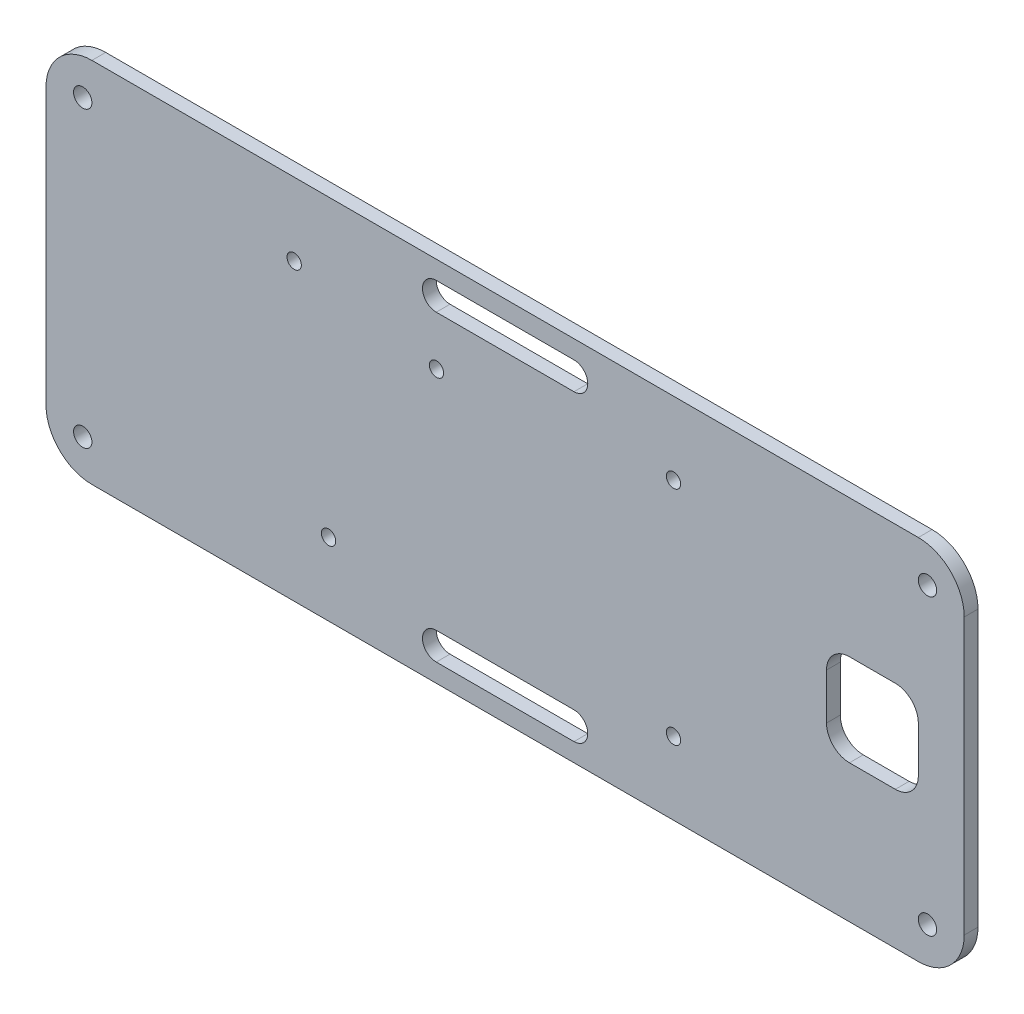
ISO-10303-21;
HEADER;
FILE_DESCRIPTION(('STEP AP214'),'2;1');
FILE_NAME('part.step','',(''),(''),'','','');
FILE_SCHEMA(('AUTOMOTIVE_DESIGN { 1 0 10303 214 1 1 1 1 }'));
ENDSEC;
DATA;
#1=APPLICATION_CONTEXT('core data for automotive mechanical design processes');
#2=APPLICATION_PROTOCOL_DEFINITION('international standard','automotive_design',2000,#1);
#3=PRODUCT_CONTEXT('',#1,'mechanical');
#4=PRODUCT('Part','Part','',(#3));
#5=PRODUCT_RELATED_PRODUCT_CATEGORY('part','',(#4));
#6=PRODUCT_DEFINITION_FORMATION('','',#4);
#7=PRODUCT_DEFINITION_CONTEXT('part definition',#1,'design');
#8=PRODUCT_DEFINITION('design','',#6,#7);
#9=PRODUCT_DEFINITION_SHAPE('','',#8);
#10=(LENGTH_UNIT() NAMED_UNIT(*) SI_UNIT(.MILLI.,.METRE.));
#11=(NAMED_UNIT(*) PLANE_ANGLE_UNIT() SI_UNIT($,.RADIAN.));
#12=(NAMED_UNIT(*) SI_UNIT($,.STERADIAN.) SOLID_ANGLE_UNIT());
#13=UNCERTAINTY_MEASURE_WITH_UNIT(LENGTH_MEASURE(1.E-05),#10,'distance_accuracy_value','');
#14=(GEOMETRIC_REPRESENTATION_CONTEXT(3) GLOBAL_UNCERTAINTY_ASSIGNED_CONTEXT((#13)) GLOBAL_UNIT_ASSIGNED_CONTEXT((#10,
#11,#12)) REPRESENTATION_CONTEXT('',''));
#15=CARTESIAN_POINT('',(0.,0.,0.));
#16=DIRECTION('',(0.,0.,1.));
#17=DIRECTION('',(1.,0.,0.));
#18=AXIS2_PLACEMENT_3D('',#15,#16,#17);
#19=CARTESIAN_POINT('',(100.,40.,3.));
#20=DIRECTION('',(-1.,0.,0.));
#21=DIRECTION('',(0.,0.,1.));
#22=AXIS2_PLACEMENT_3D('',#19,#20,#21);
#23=PLANE('',#22);
#24=DIRECTION('',(0.,1.,0.));
#25=VECTOR('',#24,1.);
#26=CARTESIAN_POINT('',(100.,40.,3.));
#27=LINE('',#26,#25);
#28=CARTESIAN_POINT('',(100.,-30.,3.));
#29=VERTEX_POINT('',#28);
#30=CARTESIAN_POINT('',(100.,30.,3.));
#31=VERTEX_POINT('',#30);
#32=EDGE_CURVE('E341',#29,#31,#27,.T.);
#33=ORIENTED_EDGE('',*,*,#32,.F.);
#34=DIRECTION('',(0.,0.,-1.));
#35=VECTOR('',#34,1.);
#36=CARTESIAN_POINT('',(100.,-30.,3.));
#37=LINE('',#36,#35);
#38=CARTESIAN_POINT('',(100.,-30.,0.));
#39=VERTEX_POINT('',#38);
#40=EDGE_CURVE('E392',#29,#39,#37,.T.);
#41=ORIENTED_EDGE('',*,*,#40,.T.);
#42=DIRECTION('',(0.,1.,0.));
#43=VECTOR('',#42,1.);
#44=CARTESIAN_POINT('',(100.,40.,0.));
#45=LINE('',#44,#43);
#46=CARTESIAN_POINT('',(100.,30.,0.));
#47=VERTEX_POINT('',#46);
#48=EDGE_CURVE('E338',#39,#47,#45,.T.);
#49=ORIENTED_EDGE('',*,*,#48,.T.);
#50=DIRECTION('',(0.,0.,-1.));
#51=VECTOR('',#50,1.);
#52=CARTESIAN_POINT('',(100.,30.,3.));
#53=LINE('',#52,#51);
#54=EDGE_CURVE('E390',#47,#31,#53,.F.);
#55=ORIENTED_EDGE('',*,*,#54,.T.);
#56=EDGE_LOOP('',(#33,#41,#49,#55));
#57=FACE_BOUND('',#56,.T.);
#58=ADVANCED_FACE('F33',(#57),#23,.F.);
#59=CARTESIAN_POINT('',(-100.,40.,3.));
#60=DIRECTION('',(0.,-1.,0.));
#61=DIRECTION('',(0.,0.,-1.));
#62=AXIS2_PLACEMENT_3D('',#59,#60,#61);
#63=PLANE('',#62);
#64=DIRECTION('',(-1.,0.,0.));
#65=VECTOR('',#64,1.);
#66=CARTESIAN_POINT('',(-100.,40.,3.));
#67=LINE('',#66,#65);
#68=CARTESIAN_POINT('',(90.,40.,3.));
#69=VERTEX_POINT('',#68);
#70=CARTESIAN_POINT('',(-90.,40.,3.));
#71=VERTEX_POINT('',#70);
#72=EDGE_CURVE('E344',#69,#71,#67,.T.);
#73=ORIENTED_EDGE('',*,*,#72,.F.);
#74=DIRECTION('',(0.,0.,-1.));
#75=VECTOR('',#74,1.);
#76=CARTESIAN_POINT('',(90.,40.,3.));
#77=LINE('',#76,#75);
#78=CARTESIAN_POINT('',(90.,40.,0.));
#79=VERTEX_POINT('',#78);
#80=EDGE_CURVE('E397',#69,#79,#77,.T.);
#81=ORIENTED_EDGE('',*,*,#80,.T.);
#82=DIRECTION('',(-1.,0.,0.));
#83=VECTOR('',#82,1.);
#84=CARTESIAN_POINT('',(-100.,40.,0.));
#85=LINE('',#84,#83);
#86=CARTESIAN_POINT('',(-90.,40.,0.));
#87=VERTEX_POINT('',#86);
#88=EDGE_CURVE('E357',#79,#87,#85,.T.);
#89=ORIENTED_EDGE('',*,*,#88,.T.);
#90=DIRECTION('',(0.,0.,-1.));
#91=VECTOR('',#90,1.);
#92=CARTESIAN_POINT('',(-90.,40.,3.));
#93=LINE('',#92,#91);
#94=EDGE_CURVE('E395',#87,#71,#93,.F.);
#95=ORIENTED_EDGE('',*,*,#94,.T.);
#96=EDGE_LOOP('',(#73,#81,#89,#95));
#97=FACE_BOUND('',#96,.T.);
#98=ADVANCED_FACE('F481',(#97),#63,.F.);
#99=CARTESIAN_POINT('',(-100.,40.,3.));
#100=DIRECTION('',(1.,0.,0.));
#101=DIRECTION('',(0.,0.,-1.));
#102=AXIS2_PLACEMENT_3D('',#99,#100,#101);
#103=PLANE('',#102);
#104=DIRECTION('',(0.,-1.,0.));
#105=VECTOR('',#104,1.);
#106=CARTESIAN_POINT('',(-100.,40.,0.));
#107=LINE('',#106,#105);
#108=CARTESIAN_POINT('',(-100.,30.,0.));
#109=VERTEX_POINT('',#108);
#110=CARTESIAN_POINT('',(-100.,-30.,0.));
#111=VERTEX_POINT('',#110);
#112=EDGE_CURVE('E360',#109,#111,#107,.T.);
#113=ORIENTED_EDGE('',*,*,#112,.T.);
#114=DIRECTION('',(0.,0.,-1.));
#115=VECTOR('',#114,1.);
#116=CARTESIAN_POINT('',(-100.,-30.,3.));
#117=LINE('',#116,#115);
#118=CARTESIAN_POINT('',(-100.,-30.,3.));
#119=VERTEX_POINT('',#118);
#120=EDGE_CURVE('E380',#111,#119,#117,.F.);
#121=ORIENTED_EDGE('',*,*,#120,.T.);
#122=DIRECTION('',(0.,-1.,0.));
#123=VECTOR('',#122,1.);
#124=CARTESIAN_POINT('',(-100.,40.,3.));
#125=LINE('',#124,#123);
#126=CARTESIAN_POINT('',(-100.,30.,3.));
#127=VERTEX_POINT('',#126);
#128=EDGE_CURVE('E348',#127,#119,#125,.T.);
#129=ORIENTED_EDGE('',*,*,#128,.F.);
#130=DIRECTION('',(0.,0.,-1.));
#131=VECTOR('',#130,1.);
#132=CARTESIAN_POINT('',(-100.,30.,3.));
#133=LINE('',#132,#131);
#134=EDGE_CURVE('E377',#127,#109,#133,.T.);
#135=ORIENTED_EDGE('',*,*,#134,.T.);
#136=EDGE_LOOP('',(#113,#121,#129,#135));
#137=FACE_BOUND('',#136,.T.);
#138=ADVANCED_FACE('F487',(#137),#103,.F.);
#139=CARTESIAN_POINT('',(-100.,-40.,3.));
#140=DIRECTION('',(0.,1.,0.));
#141=DIRECTION('',(0.,0.,1.));
#142=AXIS2_PLACEMENT_3D('',#139,#140,#141);
#143=PLANE('',#142);
#144=DIRECTION('',(1.,0.,0.));
#145=VECTOR('',#144,1.);
#146=CARTESIAN_POINT('',(-100.,-40.,3.));
#147=LINE('',#146,#145);
#148=CARTESIAN_POINT('',(-90.,-40.,3.));
#149=VERTEX_POINT('',#148);
#150=CARTESIAN_POINT('',(90.,-40.,3.));
#151=VERTEX_POINT('',#150);
#152=EDGE_CURVE('E351',#149,#151,#147,.T.);
#153=ORIENTED_EDGE('',*,*,#152,.F.);
#154=DIRECTION('',(0.,0.,-1.));
#155=VECTOR('',#154,1.);
#156=CARTESIAN_POINT('',(-90.,-40.,3.));
#157=LINE('',#156,#155);
#158=CARTESIAN_POINT('',(-90.,-40.,0.));
#159=VERTEX_POINT('',#158);
#160=EDGE_CURVE('E366',#149,#159,#157,.T.);
#161=ORIENTED_EDGE('',*,*,#160,.T.);
#162=DIRECTION('',(1.,0.,0.));
#163=VECTOR('',#162,1.);
#164=CARTESIAN_POINT('',(-100.,-40.,0.));
#165=LINE('',#164,#163);
#166=CARTESIAN_POINT('',(90.,-40.,0.));
#167=VERTEX_POINT('',#166);
#168=EDGE_CURVE('E345',#159,#167,#165,.T.);
#169=ORIENTED_EDGE('',*,*,#168,.T.);
#170=DIRECTION('',(0.,0.,-1.));
#171=VECTOR('',#170,1.);
#172=CARTESIAN_POINT('',(90.,-40.,3.));
#173=LINE('',#172,#171);
#174=EDGE_CURVE('E354',#167,#151,#173,.F.);
#175=ORIENTED_EDGE('',*,*,#174,.T.);
#176=EDGE_LOOP('',(#153,#161,#169,#175));
#177=FACE_BOUND('',#176,.T.);
#178=ADVANCED_FACE('F529',(#177),#143,.F.);
#179=CARTESIAN_POINT('',(0.,0.,3.));
#180=DIRECTION('',(0.,0.,1.));
#181=DIRECTION('',(1.,0.,0.));
#182=AXIS2_PLACEMENT_3D('',#179,#180,#181);
#183=PLANE('',#182);
#184=CARTESIAN_POINT('',(-15.,-33.,3.));
#185=DIRECTION('',(0.,0.,1.));
#186=DIRECTION('',(1.,0.,0.));
#187=AXIS2_PLACEMENT_3D('',#184,#185,#186);
#188=CIRCLE('',#187,3.);
#189=CARTESIAN_POINT('',(-15.,-30.,3.));
#190=VERTEX_POINT('',#189);
#191=CARTESIAN_POINT('',(-15.,-36.,3.));
#192=VERTEX_POINT('',#191);
#193=EDGE_CURVE('E48',#190,#192,#188,.T.);
#194=ORIENTED_EDGE('',*,*,#193,.F.);
#195=DIRECTION('',(-1.,0.,0.));
#196=VECTOR('',#195,1.);
#197=CARTESIAN_POINT('',(-15.,-30.,3.));
#198=LINE('',#197,#196);
#199=CARTESIAN_POINT('',(15.,-30.,3.));
#200=VERTEX_POINT('',#199);
#201=EDGE_CURVE('E214',#200,#190,#198,.T.);
#202=ORIENTED_EDGE('',*,*,#201,.F.);
#203=CARTESIAN_POINT('',(15.,-33.,3.));
#204=DIRECTION('',(0.,0.,1.));
#205=DIRECTION('',(1.,0.,0.));
#206=AXIS2_PLACEMENT_3D('',#203,#204,#205);
#207=CIRCLE('',#206,3.);
#208=CARTESIAN_POINT('',(15.,-36.,3.));
#209=VERTEX_POINT('',#208);
#210=EDGE_CURVE('E217',#209,#200,#207,.T.);
#211=ORIENTED_EDGE('',*,*,#210,.F.);
#212=DIRECTION('',(1.,0.,0.));
#213=VECTOR('',#212,1.);
#214=CARTESIAN_POINT('',(-15.,-36.,3.));
#215=LINE('',#214,#213);
#216=EDGE_CURVE('E223',#192,#209,#215,.T.);
#217=ORIENTED_EDGE('',*,*,#216,.F.);
#218=EDGE_LOOP('',(#194,#202,#211,#217));
#219=FACE_BOUND('',#218,.T.);
#220=CARTESIAN_POINT('',(-15.,33.,3.));
#221=DIRECTION('',(0.,0.,1.));
#222=DIRECTION('',(-1.,0.,0.));
#223=AXIS2_PLACEMENT_3D('',#220,#221,#222);
#224=CIRCLE('',#223,3.);
#225=CARTESIAN_POINT('',(-15.,36.,3.));
#226=VERTEX_POINT('',#225);
#227=CARTESIAN_POINT('',(-15.,30.,3.));
#228=VERTEX_POINT('',#227);
#229=EDGE_CURVE('E56',#226,#228,#224,.T.);
#230=ORIENTED_EDGE('',*,*,#229,.F.);
#231=DIRECTION('',(-1.,0.,0.));
#232=VECTOR('',#231,1.);
#233=CARTESIAN_POINT('',(-15.,36.,3.));
#234=LINE('',#233,#232);
#235=CARTESIAN_POINT('',(15.,36.,3.));
#236=VERTEX_POINT('',#235);
#237=EDGE_CURVE('E238',#236,#226,#234,.T.);
#238=ORIENTED_EDGE('',*,*,#237,.F.);
#239=CARTESIAN_POINT('',(15.,33.,3.));
#240=DIRECTION('',(0.,0.,1.));
#241=DIRECTION('',(-1.,0.,0.));
#242=AXIS2_PLACEMENT_3D('',#239,#240,#241);
#243=CIRCLE('',#242,3.);
#244=CARTESIAN_POINT('',(15.,30.,3.));
#245=VERTEX_POINT('',#244);
#246=EDGE_CURVE('E252',#245,#236,#243,.T.);
#247=ORIENTED_EDGE('',*,*,#246,.F.);
#248=DIRECTION('',(1.,0.,0.));
#249=VECTOR('',#248,1.);
#250=CARTESIAN_POINT('',(-15.,30.,3.));
#251=LINE('',#250,#249);
#252=EDGE_CURVE('E249',#228,#245,#251,.T.);
#253=ORIENTED_EDGE('',*,*,#252,.F.);
#254=EDGE_LOOP('',(#230,#238,#247,#253));
#255=FACE_BOUND('',#254,.T.);
#256=DIRECTION('',(0.,1.,0.));
#257=VECTOR('',#256,1.);
#258=CARTESIAN_POINT('',(90.,10.,3.));
#259=LINE('',#258,#257);
#260=CARTESIAN_POINT('',(90.,-5.,3.));
#261=VERTEX_POINT('',#260);
#262=CARTESIAN_POINT('',(90.,5.,3.));
#263=VERTEX_POINT('',#262);
#264=EDGE_CURVE('E230',#261,#263,#259,.T.);
#265=ORIENTED_EDGE('',*,*,#264,.F.);
#266=CARTESIAN_POINT('',(85.,-5.,3.));
#267=DIRECTION('',(0.,0.,1.));
#268=DIRECTION('',(1.,0.,0.));
#269=AXIS2_PLACEMENT_3D('',#266,#267,#268);
#270=CIRCLE('',#269,5.);
#271=CARTESIAN_POINT('',(85.,-9.99999999999999,3.));
#272=VERTEX_POINT('',#271);
#273=EDGE_CURVE('E420',#261,#272,#270,.F.);
#274=ORIENTED_EDGE('',*,*,#273,.T.);
#275=DIRECTION('',(1.,0.,0.));
#276=VECTOR('',#275,1.);
#277=CARTESIAN_POINT('',(70.,-10.,3.));
#278=LINE('',#277,#276);
#279=CARTESIAN_POINT('',(75.,-10.,3.));
#280=VERTEX_POINT('',#279);
#281=EDGE_CURVE('E267',#280,#272,#278,.T.);
#282=ORIENTED_EDGE('',*,*,#281,.F.);
#283=CARTESIAN_POINT('',(75.,-5.,3.));
#284=DIRECTION('',(0.,0.,1.));
#285=DIRECTION('',(1.,0.,0.));
#286=AXIS2_PLACEMENT_3D('',#283,#284,#285);
#287=CIRCLE('',#286,5.);
#288=CARTESIAN_POINT('',(70.,-5.,3.));
#289=VERTEX_POINT('',#288);
#290=EDGE_CURVE('E424',#280,#289,#287,.F.);
#291=ORIENTED_EDGE('',*,*,#290,.T.);
#292=DIRECTION('',(0.,-1.,0.));
#293=VECTOR('',#292,1.);
#294=CARTESIAN_POINT('',(70.,10.,3.));
#295=LINE('',#294,#293);
#296=CARTESIAN_POINT('',(70.,5.,3.));
#297=VERTEX_POINT('',#296);
#298=EDGE_CURVE('E282',#297,#289,#295,.T.);
#299=ORIENTED_EDGE('',*,*,#298,.F.);
#300=CARTESIAN_POINT('',(75.,5.,3.));
#301=DIRECTION('',(0.,0.,1.));
#302=DIRECTION('',(1.,0.,0.));
#303=AXIS2_PLACEMENT_3D('',#300,#301,#302);
#304=CIRCLE('',#303,5.);
#305=CARTESIAN_POINT('',(75.,10.,3.));
#306=VERTEX_POINT('',#305);
#307=EDGE_CURVE('E428',#297,#306,#304,.F.);
#308=ORIENTED_EDGE('',*,*,#307,.T.);
#309=DIRECTION('',(-1.,0.,0.));
#310=VECTOR('',#309,1.);
#311=CARTESIAN_POINT('',(70.,10.,3.));
#312=LINE('',#311,#310);
#313=CARTESIAN_POINT('',(85.,10.,3.));
#314=VERTEX_POINT('',#313);
#315=EDGE_CURVE('E279',#314,#306,#312,.T.);
#316=ORIENTED_EDGE('',*,*,#315,.F.);
#317=CARTESIAN_POINT('',(85.,5.,3.));
#318=DIRECTION('',(0.,0.,1.));
#319=DIRECTION('',(1.,0.,0.));
#320=AXIS2_PLACEMENT_3D('',#317,#318,#319);
#321=CIRCLE('',#320,5.);
#322=EDGE_CURVE('E41',#314,#263,#321,.F.);
#323=ORIENTED_EDGE('',*,*,#322,.T.);
#324=EDGE_LOOP('',(#265,#274,#282,#291,#299,#308,#316,#323));
#325=FACE_BOUND('',#324,.T.);
#326=CARTESIAN_POINT('',(-14.9479,19.2896072336668,3.));
#327=DIRECTION('',(0.,0.,1.));
#328=DIRECTION('',(1.,0.,0.));
#329=AXIS2_PLACEMENT_3D('',#326,#327,#328);
#330=CIRCLE('',#329,1.5621);
#331=CARTESIAN_POINT('',(-13.3858,19.2896072336668,3.));
#332=VERTEX_POINT('',#331);
#333=EDGE_CURVE('E276',#332,#332,#330,.T.);
#334=ORIENTED_EDGE('',*,*,#333,.F.);
#335=EDGE_LOOP('',(#334));
#336=FACE_BOUND('',#335,.T.);
#337=CARTESIAN_POINT('',(-45.9486,24.1681,3.));
#338=DIRECTION('',(0.,0.,1.));
#339=DIRECTION('',(1.,0.,0.));
#340=AXIS2_PLACEMENT_3D('',#337,#338,#339);
#341=CIRCLE('',#340,1.5621);
#342=CARTESIAN_POINT('',(-44.3865,24.1681,3.));
#343=VERTEX_POINT('',#342);
#344=EDGE_CURVE('E303',#343,#343,#341,.T.);
#345=ORIENTED_EDGE('',*,*,#344,.F.);
#346=EDGE_LOOP('',(#345));
#347=FACE_BOUND('',#346,.T.);
#348=CARTESIAN_POINT('',(-38.4556,-24.1681,3.));
#349=DIRECTION('',(0.,0.,1.));
#350=DIRECTION('',(1.,0.,0.));
#351=AXIS2_PLACEMENT_3D('',#348,#349,#350);
#352=CIRCLE('',#351,1.5621);
#353=CARTESIAN_POINT('',(-36.8935,-24.1681,3.));
#354=VERTEX_POINT('',#353);
#355=EDGE_CURVE('E297',#354,#354,#352,.T.);
#356=ORIENTED_EDGE('',*,*,#355,.F.);
#357=EDGE_LOOP('',(#356));
#358=FACE_BOUND('',#357,.T.);
#359=CARTESIAN_POINT('',(36.6776,-24.1681,3.));
#360=DIRECTION('',(0.,0.,1.));
#361=DIRECTION('',(1.,0.,0.));
#362=AXIS2_PLACEMENT_3D('',#359,#360,#361);
#363=CIRCLE('',#362,1.5621);
#364=CARTESIAN_POINT('',(38.2397,-24.1681,3.));
#365=VERTEX_POINT('',#364);
#366=EDGE_CURVE('E291',#365,#365,#363,.T.);
#367=ORIENTED_EDGE('',*,*,#366,.F.);
#368=EDGE_LOOP('',(#367));
#369=FACE_BOUND('',#368,.T.);
#370=CARTESIAN_POINT('',(36.6776,24.1681,3.));
#371=DIRECTION('',(0.,0.,1.));
#372=DIRECTION('',(1.,0.,0.));
#373=AXIS2_PLACEMENT_3D('',#370,#371,#372);
#374=CIRCLE('',#373,1.5621);
#375=CARTESIAN_POINT('',(38.2397,24.1681,3.));
#376=VERTEX_POINT('',#375);
#377=EDGE_CURVE('E290',#376,#376,#374,.T.);
#378=ORIENTED_EDGE('',*,*,#377,.F.);
#379=EDGE_LOOP('',(#378));
#380=FACE_BOUND('',#379,.T.);
#381=CARTESIAN_POINT('',(92.,32.,3.));
#382=DIRECTION('',(0.,0.,1.));
#383=DIRECTION('',(-1.,0.,0.));
#384=AXIS2_PLACEMENT_3D('',#381,#382,#383);
#385=CIRCLE('',#384,2.);
#386=CARTESIAN_POINT('',(90.,32.,3.));
#387=VERTEX_POINT('',#386);
#388=EDGE_CURVE('E314',#387,#387,#385,.T.);
#389=ORIENTED_EDGE('',*,*,#388,.F.);
#390=EDGE_LOOP('',(#389));
#391=FACE_BOUND('',#390,.T.);
#392=CARTESIAN_POINT('',(92.0000000000001,-32.,3.));
#393=DIRECTION('',(0.,0.,1.));
#394=DIRECTION('',(1.,0.,0.));
#395=AXIS2_PLACEMENT_3D('',#392,#393,#394);
#396=CIRCLE('',#395,2.);
#397=CARTESIAN_POINT('',(94.0000000000001,-32.,3.));
#398=VERTEX_POINT('',#397);
#399=EDGE_CURVE('E327',#398,#398,#396,.T.);
#400=ORIENTED_EDGE('',*,*,#399,.F.);
#401=EDGE_LOOP('',(#400));
#402=FACE_BOUND('',#401,.T.);
#403=CARTESIAN_POINT('',(-92.,-32.,3.));
#404=DIRECTION('',(0.,0.,1.));
#405=DIRECTION('',(-1.,0.,0.));
#406=AXIS2_PLACEMENT_3D('',#403,#404,#405);
#407=CIRCLE('',#406,2.);
#408=CARTESIAN_POINT('',(-94.,-32.,3.));
#409=VERTEX_POINT('',#408);
#410=EDGE_CURVE('E321',#409,#409,#407,.T.);
#411=ORIENTED_EDGE('',*,*,#410,.F.);
#412=EDGE_LOOP('',(#411));
#413=FACE_BOUND('',#412,.T.);
#414=CARTESIAN_POINT('',(-92.,32.,3.));
#415=DIRECTION('',(0.,0.,1.));
#416=DIRECTION('',(1.,0.,0.));
#417=AXIS2_PLACEMENT_3D('',#414,#415,#416);
#418=CIRCLE('',#417,2.);
#419=CARTESIAN_POINT('',(-90.,32.,3.));
#420=VERTEX_POINT('',#419);
#421=EDGE_CURVE('E320',#420,#420,#418,.T.);
#422=ORIENTED_EDGE('',*,*,#421,.F.);
#423=EDGE_LOOP('',(#422));
#424=FACE_BOUND('',#423,.T.);
#425=ORIENTED_EDGE('',*,*,#128,.T.);
#426=CARTESIAN_POINT('',(-90.,-30.,3.));
#427=DIRECTION('',(0.,0.,1.));
#428=DIRECTION('',(1.,0.,0.));
#429=AXIS2_PLACEMENT_3D('',#426,#427,#428);
#430=CIRCLE('',#429,10.);
#431=EDGE_CURVE('E388',#119,#149,#430,.T.);
#432=ORIENTED_EDGE('',*,*,#431,.T.);
#433=ORIENTED_EDGE('',*,*,#152,.T.);
#434=CARTESIAN_POINT('',(90.,-30.,3.));
#435=DIRECTION('',(0.,0.,1.));
#436=DIRECTION('',(1.,0.,0.));
#437=AXIS2_PLACEMENT_3D('',#434,#435,#436);
#438=CIRCLE('',#437,10.);
#439=EDGE_CURVE('E386',#151,#29,#438,.T.);
#440=ORIENTED_EDGE('',*,*,#439,.T.);
#441=ORIENTED_EDGE('',*,*,#32,.T.);
#442=CARTESIAN_POINT('',(90.,30.,3.));
#443=DIRECTION('',(0.,0.,1.));
#444=DIRECTION('',(1.,0.,0.));
#445=AXIS2_PLACEMENT_3D('',#442,#443,#444);
#446=CIRCLE('',#445,10.);
#447=EDGE_CURVE('E384',#31,#69,#446,.T.);
#448=ORIENTED_EDGE('',*,*,#447,.T.);
#449=ORIENTED_EDGE('',*,*,#72,.T.);
#450=CARTESIAN_POINT('',(-90.,30.,3.));
#451=DIRECTION('',(0.,0.,1.));
#452=DIRECTION('',(1.,0.,0.));
#453=AXIS2_PLACEMENT_3D('',#450,#451,#452);
#454=CIRCLE('',#453,10.);
#455=EDGE_CURVE('E382',#71,#127,#454,.T.);
#456=ORIENTED_EDGE('',*,*,#455,.T.);
#457=EDGE_LOOP('',(#425,#432,#433,#440,#441,#448,#449,#456));
#458=FACE_BOUND('',#457,.T.);
#459=ADVANCED_FACE('F434',(#219,#255,#325,#336,#347,#358,#369,#380,#391,#402,#413,#424,#458),
#183,.T.);
#460=CARTESIAN_POINT('',(0.,0.,0.));
#461=DIRECTION('',(0.,0.,1.));
#462=DIRECTION('',(1.,0.,0.));
#463=AXIS2_PLACEMENT_3D('',#460,#461,#462);
#464=PLANE('',#463);
#465=DIRECTION('',(-1.,0.,0.));
#466=VECTOR('',#465,1.);
#467=CARTESIAN_POINT('',(-15.,-30.,0.));
#468=LINE('',#467,#466);
#469=CARTESIAN_POINT('',(15.,-30.,0.));
#470=VERTEX_POINT('',#469);
#471=CARTESIAN_POINT('',(-15.,-30.,0.));
#472=VERTEX_POINT('',#471);
#473=EDGE_CURVE('E201',#470,#472,#468,.T.);
#474=ORIENTED_EDGE('',*,*,#473,.T.);
#475=CARTESIAN_POINT('',(-15.,-33.,0.));
#476=DIRECTION('',(0.,0.,1.));
#477=DIRECTION('',(1.,0.,0.));
#478=AXIS2_PLACEMENT_3D('',#475,#476,#477);
#479=CIRCLE('',#478,3.);
#480=CARTESIAN_POINT('',(-15.,-36.,0.));
#481=VERTEX_POINT('',#480);
#482=EDGE_CURVE('E195',#472,#481,#479,.T.);
#483=ORIENTED_EDGE('',*,*,#482,.T.);
#484=DIRECTION('',(1.,0.,0.));
#485=VECTOR('',#484,1.);
#486=CARTESIAN_POINT('',(-15.,-36.,0.));
#487=LINE('',#486,#485);
#488=CARTESIAN_POINT('',(15.,-36.,0.));
#489=VERTEX_POINT('',#488);
#490=EDGE_CURVE('E205',#481,#489,#487,.T.);
#491=ORIENTED_EDGE('',*,*,#490,.T.);
#492=CARTESIAN_POINT('',(15.,-33.,0.));
#493=DIRECTION('',(0.,0.,1.));
#494=DIRECTION('',(1.,0.,0.));
#495=AXIS2_PLACEMENT_3D('',#492,#493,#494);
#496=CIRCLE('',#495,3.);
#497=EDGE_CURVE('E209',#489,#470,#496,.T.);
#498=ORIENTED_EDGE('',*,*,#497,.T.);
#499=EDGE_LOOP('',(#474,#483,#491,#498));
#500=FACE_BOUND('',#499,.T.);
#501=DIRECTION('',(-1.,0.,0.));
#502=VECTOR('',#501,1.);
#503=CARTESIAN_POINT('',(-15.,36.,0.));
#504=LINE('',#503,#502);
#505=CARTESIAN_POINT('',(15.,36.,0.));
#506=VERTEX_POINT('',#505);
#507=CARTESIAN_POINT('',(-15.,36.,0.));
#508=VERTEX_POINT('',#507);
#509=EDGE_CURVE('E244',#506,#508,#504,.T.);
#510=ORIENTED_EDGE('',*,*,#509,.T.);
#511=CARTESIAN_POINT('',(-15.,33.,0.));
#512=DIRECTION('',(0.,0.,1.));
#513=DIRECTION('',(-1.,0.,0.));
#514=AXIS2_PLACEMENT_3D('',#511,#512,#513);
#515=CIRCLE('',#514,3.);
#516=CARTESIAN_POINT('',(-15.,30.,0.));
#517=VERTEX_POINT('',#516);
#518=EDGE_CURVE('E234',#508,#517,#515,.T.);
#519=ORIENTED_EDGE('',*,*,#518,.T.);
#520=DIRECTION('',(1.,0.,0.));
#521=VECTOR('',#520,1.);
#522=CARTESIAN_POINT('',(-15.,30.,0.));
#523=LINE('',#522,#521);
#524=CARTESIAN_POINT('',(15.,30.,0.));
#525=VERTEX_POINT('',#524);
#526=EDGE_CURVE('E237',#517,#525,#523,.T.);
#527=ORIENTED_EDGE('',*,*,#526,.T.);
#528=CARTESIAN_POINT('',(15.,33.,0.));
#529=DIRECTION('',(0.,0.,1.));
#530=DIRECTION('',(-1.,0.,0.));
#531=AXIS2_PLACEMENT_3D('',#528,#529,#530);
#532=CIRCLE('',#531,3.);
#533=EDGE_CURVE('E241',#525,#506,#532,.T.);
#534=ORIENTED_EDGE('',*,*,#533,.T.);
#535=EDGE_LOOP('',(#510,#519,#527,#534));
#536=FACE_BOUND('',#535,.T.);
#537=DIRECTION('',(0.,-1.,0.));
#538=VECTOR('',#537,1.);
#539=CARTESIAN_POINT('',(70.,10.,0.));
#540=LINE('',#539,#538);
#541=CARTESIAN_POINT('',(70.,5.,0.));
#542=VERTEX_POINT('',#541);
#543=CARTESIAN_POINT('',(70.,-5.,0.));
#544=VERTEX_POINT('',#543);
#545=EDGE_CURVE('E270',#542,#544,#540,.T.);
#546=ORIENTED_EDGE('',*,*,#545,.T.);
#547=CARTESIAN_POINT('',(75.,-5.,0.));
#548=DIRECTION('',(0.,0.,1.));
#549=DIRECTION('',(1.,0.,0.));
#550=AXIS2_PLACEMENT_3D('',#547,#548,#549);
#551=CIRCLE('',#550,5.);
#552=CARTESIAN_POINT('',(75.,-10.,0.));
#553=VERTEX_POINT('',#552);
#554=EDGE_CURVE('E426',#544,#553,#551,.T.);
#555=ORIENTED_EDGE('',*,*,#554,.T.);
#556=DIRECTION('',(1.,0.,0.));
#557=VECTOR('',#556,1.);
#558=CARTESIAN_POINT('',(70.,-10.,0.));
#559=LINE('',#558,#557);
#560=CARTESIAN_POINT('',(85.,-9.99999999999999,0.));
#561=VERTEX_POINT('',#560);
#562=EDGE_CURVE('E273',#553,#561,#559,.T.);
#563=ORIENTED_EDGE('',*,*,#562,.T.);
#564=CARTESIAN_POINT('',(85.,-5.,0.));
#565=DIRECTION('',(0.,0.,1.));
#566=DIRECTION('',(1.,0.,0.));
#567=AXIS2_PLACEMENT_3D('',#564,#565,#566);
#568=CIRCLE('',#567,5.);
#569=CARTESIAN_POINT('',(90.,-5.,0.));
#570=VERTEX_POINT('',#569);
#571=EDGE_CURVE('E422',#561,#570,#568,.T.);
#572=ORIENTED_EDGE('',*,*,#571,.T.);
#573=DIRECTION('',(0.,1.,0.));
#574=VECTOR('',#573,1.);
#575=CARTESIAN_POINT('',(90.,10.,0.));
#576=LINE('',#575,#574);
#577=CARTESIAN_POINT('',(90.,5.,0.));
#578=VERTEX_POINT('',#577);
#579=EDGE_CURVE('E263',#570,#578,#576,.T.);
#580=ORIENTED_EDGE('',*,*,#579,.T.);
#581=CARTESIAN_POINT('',(85.,5.,0.));
#582=DIRECTION('',(0.,0.,1.));
#583=DIRECTION('',(1.,0.,0.));
#584=AXIS2_PLACEMENT_3D('',#581,#582,#583);
#585=CIRCLE('',#584,5.);
#586=CARTESIAN_POINT('',(85.,10.,0.));
#587=VERTEX_POINT('',#586);
#588=EDGE_CURVE('E11',#578,#587,#585,.T.);
#589=ORIENTED_EDGE('',*,*,#588,.T.);
#590=DIRECTION('',(-1.,0.,0.));
#591=VECTOR('',#590,1.);
#592=CARTESIAN_POINT('',(70.,10.,0.));
#593=LINE('',#592,#591);
#594=CARTESIAN_POINT('',(75.,10.,0.));
#595=VERTEX_POINT('',#594);
#596=EDGE_CURVE('E266',#587,#595,#593,.T.);
#597=ORIENTED_EDGE('',*,*,#596,.T.);
#598=CARTESIAN_POINT('',(75.,5.,0.));
#599=DIRECTION('',(0.,0.,1.));
#600=DIRECTION('',(1.,0.,0.));
#601=AXIS2_PLACEMENT_3D('',#598,#599,#600);
#602=CIRCLE('',#601,5.);
#603=EDGE_CURVE('E430',#595,#542,#602,.T.);
#604=ORIENTED_EDGE('',*,*,#603,.T.);
#605=EDGE_LOOP('',(#546,#555,#563,#572,#580,#589,#597,#604));
#606=FACE_BOUND('',#605,.T.);
#607=CARTESIAN_POINT('',(-14.9479,19.2896072336668,0.));
#608=DIRECTION('',(0.,0.,1.));
#609=DIRECTION('',(1.,0.,0.));
#610=AXIS2_PLACEMENT_3D('',#607,#608,#609);
#611=CIRCLE('',#610,1.5621);
#612=CARTESIAN_POINT('',(-13.3858,19.2896072336668,0.));
#613=VERTEX_POINT('',#612);
#614=EDGE_CURVE('E306',#613,#613,#611,.T.);
#615=ORIENTED_EDGE('',*,*,#614,.T.);
#616=EDGE_LOOP('',(#615));
#617=FACE_BOUND('',#616,.T.);
#618=CARTESIAN_POINT('',(-45.9486,24.1681,0.));
#619=DIRECTION('',(0.,0.,1.));
#620=DIRECTION('',(1.,0.,0.));
#621=AXIS2_PLACEMENT_3D('',#618,#619,#620);
#622=CIRCLE('',#621,1.5621);
#623=CARTESIAN_POINT('',(-44.3865,24.1681,0.));
#624=VERTEX_POINT('',#623);
#625=EDGE_CURVE('E300',#624,#624,#622,.T.);
#626=ORIENTED_EDGE('',*,*,#625,.T.);
#627=EDGE_LOOP('',(#626));
#628=FACE_BOUND('',#627,.T.);
#629=CARTESIAN_POINT('',(-38.4556,-24.1681,0.));
#630=DIRECTION('',(0.,0.,1.));
#631=DIRECTION('',(1.,0.,0.));
#632=AXIS2_PLACEMENT_3D('',#629,#630,#631);
#633=CIRCLE('',#632,1.5621);
#634=CARTESIAN_POINT('',(-36.8935,-24.1681,0.));
#635=VERTEX_POINT('',#634);
#636=EDGE_CURVE('E294',#635,#635,#633,.T.);
#637=ORIENTED_EDGE('',*,*,#636,.T.);
#638=EDGE_LOOP('',(#637));
#639=FACE_BOUND('',#638,.T.);
#640=CARTESIAN_POINT('',(36.6776,-24.1681,0.));
#641=DIRECTION('',(0.,0.,1.));
#642=DIRECTION('',(1.,0.,0.));
#643=AXIS2_PLACEMENT_3D('',#640,#641,#642);
#644=CIRCLE('',#643,1.5621);
#645=CARTESIAN_POINT('',(38.2397,-24.1681,0.));
#646=VERTEX_POINT('',#645);
#647=EDGE_CURVE('E287',#646,#646,#644,.T.);
#648=ORIENTED_EDGE('',*,*,#647,.T.);
#649=EDGE_LOOP('',(#648));
#650=FACE_BOUND('',#649,.T.);
#651=CARTESIAN_POINT('',(36.6776,24.1681,0.));
#652=DIRECTION('',(0.,0.,1.));
#653=DIRECTION('',(1.,0.,0.));
#654=AXIS2_PLACEMENT_3D('',#651,#652,#653);
#655=CIRCLE('',#654,1.5621);
#656=CARTESIAN_POINT('',(38.2397,24.1681,0.));
#657=VERTEX_POINT('',#656);
#658=EDGE_CURVE('E311',#657,#657,#655,.T.);
#659=ORIENTED_EDGE('',*,*,#658,.T.);
#660=EDGE_LOOP('',(#659));
#661=FACE_BOUND('',#660,.T.);
#662=CARTESIAN_POINT('',(92.,32.,0.));
#663=DIRECTION('',(0.,0.,1.));
#664=DIRECTION('',(-1.,0.,0.));
#665=AXIS2_PLACEMENT_3D('',#662,#663,#664);
#666=CIRCLE('',#665,2.);
#667=CARTESIAN_POINT('',(90.,32.,0.));
#668=VERTEX_POINT('',#667);
#669=EDGE_CURVE('E330',#668,#668,#666,.T.);
#670=ORIENTED_EDGE('',*,*,#669,.T.);
#671=EDGE_LOOP('',(#670));
#672=FACE_BOUND('',#671,.T.);
#673=CARTESIAN_POINT('',(92.0000000000001,-32.,0.));
#674=DIRECTION('',(0.,0.,1.));
#675=DIRECTION('',(1.,0.,0.));
#676=AXIS2_PLACEMENT_3D('',#673,#674,#675);
#677=CIRCLE('',#676,2.);
#678=CARTESIAN_POINT('',(94.0000000000001,-32.,0.));
#679=VERTEX_POINT('',#678);
#680=EDGE_CURVE('E324',#679,#679,#677,.T.);
#681=ORIENTED_EDGE('',*,*,#680,.T.);
#682=EDGE_LOOP('',(#681));
#683=FACE_BOUND('',#682,.T.);
#684=CARTESIAN_POINT('',(-92.,-32.,0.));
#685=DIRECTION('',(0.,0.,1.));
#686=DIRECTION('',(-1.,0.,0.));
#687=AXIS2_PLACEMENT_3D('',#684,#685,#686);
#688=CIRCLE('',#687,2.);
#689=CARTESIAN_POINT('',(-94.,-32.,0.));
#690=VERTEX_POINT('',#689);
#691=EDGE_CURVE('E317',#690,#690,#688,.T.);
#692=ORIENTED_EDGE('',*,*,#691,.T.);
#693=EDGE_LOOP('',(#692));
#694=FACE_BOUND('',#693,.T.);
#695=CARTESIAN_POINT('',(-92.,32.,0.));
#696=DIRECTION('',(0.,0.,1.));
#697=DIRECTION('',(1.,0.,0.));
#698=AXIS2_PLACEMENT_3D('',#695,#696,#697);
#699=CIRCLE('',#698,2.);
#700=CARTESIAN_POINT('',(-90.,32.,0.));
#701=VERTEX_POINT('',#700);
#702=EDGE_CURVE('E335',#701,#701,#699,.T.);
#703=ORIENTED_EDGE('',*,*,#702,.T.);
#704=EDGE_LOOP('',(#703));
#705=FACE_BOUND('',#704,.T.);
#706=ORIENTED_EDGE('',*,*,#168,.F.);
#707=CARTESIAN_POINT('',(-90.,-30.,0.));
#708=DIRECTION('',(0.,0.,1.));
#709=DIRECTION('',(1.,0.,0.));
#710=AXIS2_PLACEMENT_3D('',#707,#708,#709);
#711=CIRCLE('',#710,10.);
#712=EDGE_CURVE('E375',#159,#111,#711,.F.);
#713=ORIENTED_EDGE('',*,*,#712,.T.);
#714=ORIENTED_EDGE('',*,*,#112,.F.);
#715=CARTESIAN_POINT('',(-90.,30.,0.));
#716=DIRECTION('',(0.,0.,1.));
#717=DIRECTION('',(1.,0.,0.));
#718=AXIS2_PLACEMENT_3D('',#715,#716,#717);
#719=CIRCLE('',#718,10.);
#720=EDGE_CURVE('E369',#109,#87,#719,.F.);
#721=ORIENTED_EDGE('',*,*,#720,.T.);
#722=ORIENTED_EDGE('',*,*,#88,.F.);
#723=CARTESIAN_POINT('',(90.,30.,0.));
#724=DIRECTION('',(0.,0.,1.));
#725=DIRECTION('',(1.,0.,0.));
#726=AXIS2_PLACEMENT_3D('',#723,#724,#725);
#727=CIRCLE('',#726,10.);
#728=EDGE_CURVE('E371',#79,#47,#727,.F.);
#729=ORIENTED_EDGE('',*,*,#728,.T.);
#730=ORIENTED_EDGE('',*,*,#48,.F.);
#731=CARTESIAN_POINT('',(90.,-30.,0.));
#732=DIRECTION('',(0.,0.,1.));
#733=DIRECTION('',(1.,0.,0.));
#734=AXIS2_PLACEMENT_3D('',#731,#732,#733);
#735=CIRCLE('',#734,10.);
#736=EDGE_CURVE('E373',#39,#167,#735,.F.);
#737=ORIENTED_EDGE('',*,*,#736,.T.);
#738=EDGE_LOOP('',(#706,#713,#714,#721,#722,#729,#730,#737));
#739=FACE_BOUND('',#738,.T.);
#740=ADVANCED_FACE('F211',(#500,#536,#606,#617,#628,#639,#650,#661,#672,#683,#694,#705,#739),
#464,.F.);
#741=CARTESIAN_POINT('',(-92.,32.,0.));
#742=DIRECTION('',(0.,0.,1.));
#743=DIRECTION('',(1.,0.,0.));
#744=AXIS2_PLACEMENT_3D('',#741,#742,#743);
#745=CYLINDRICAL_SURFACE('',#744,2.);
#746=ORIENTED_EDGE('',*,*,#702,.F.);
#747=EDGE_LOOP('',(#746));
#748=FACE_BOUND('',#747,.T.);
#749=ORIENTED_EDGE('',*,*,#421,.T.);
#750=EDGE_LOOP('',(#749));
#751=FACE_BOUND('',#750,.T.);
#752=ADVANCED_FACE('F540',(#748,#751),#745,.F.);
#753=CARTESIAN_POINT('',(-92.,-32.,0.));
#754=DIRECTION('',(0.,0.,1.));
#755=DIRECTION('',(1.,0.,0.));
#756=AXIS2_PLACEMENT_3D('',#753,#754,#755);
#757=CYLINDRICAL_SURFACE('',#756,2.);
#758=ORIENTED_EDGE('',*,*,#691,.F.);
#759=EDGE_LOOP('',(#758));
#760=FACE_BOUND('',#759,.T.);
#761=ORIENTED_EDGE('',*,*,#410,.T.);
#762=EDGE_LOOP('',(#761));
#763=FACE_BOUND('',#762,.T.);
#764=ADVANCED_FACE('F546',(#760,#763),#757,.F.);
#765=CARTESIAN_POINT('',(92.0000000000001,-32.,0.));
#766=DIRECTION('',(0.,0.,1.));
#767=DIRECTION('',(1.,0.,0.));
#768=AXIS2_PLACEMENT_3D('',#765,#766,#767);
#769=CYLINDRICAL_SURFACE('',#768,2.);
#770=ORIENTED_EDGE('',*,*,#680,.F.);
#771=EDGE_LOOP('',(#770));
#772=FACE_BOUND('',#771,.T.);
#773=ORIENTED_EDGE('',*,*,#399,.T.);
#774=EDGE_LOOP('',(#773));
#775=FACE_BOUND('',#774,.T.);
#776=ADVANCED_FACE('F680',(#772,#775),#769,.F.);
#777=CARTESIAN_POINT('',(92.,32.,0.));
#778=DIRECTION('',(0.,0.,1.));
#779=DIRECTION('',(1.,0.,0.));
#780=AXIS2_PLACEMENT_3D('',#777,#778,#779);
#781=CYLINDRICAL_SURFACE('',#780,2.);
#782=ORIENTED_EDGE('',*,*,#669,.F.);
#783=EDGE_LOOP('',(#782));
#784=FACE_BOUND('',#783,.T.);
#785=ORIENTED_EDGE('',*,*,#388,.T.);
#786=EDGE_LOOP('',(#785));
#787=FACE_BOUND('',#786,.T.);
#788=ADVANCED_FACE('F497',(#784,#787),#781,.F.);
#789=CARTESIAN_POINT('',(-90.,-30.,3.));
#790=DIRECTION('',(0.,0.,-1.));
#791=DIRECTION('',(-1.,0.,0.));
#792=AXIS2_PLACEMENT_3D('',#789,#790,#791);
#793=CYLINDRICAL_SURFACE('',#792,10.);
#794=ORIENTED_EDGE('',*,*,#431,.F.);
#795=ORIENTED_EDGE('',*,*,#120,.F.);
#796=ORIENTED_EDGE('',*,*,#712,.F.);
#797=ORIENTED_EDGE('',*,*,#160,.F.);
#798=EDGE_LOOP('',(#794,#795,#796,#797));
#799=FACE_BOUND('',#798,.T.);
#800=ADVANCED_FACE('F493',(#799),#793,.T.);
#801=CARTESIAN_POINT('',(90.,-30.,3.));
#802=DIRECTION('',(0.,0.,-1.));
#803=DIRECTION('',(-1.,0.,0.));
#804=AXIS2_PLACEMENT_3D('',#801,#802,#803);
#805=CYLINDRICAL_SURFACE('',#804,10.);
#806=ORIENTED_EDGE('',*,*,#439,.F.);
#807=ORIENTED_EDGE('',*,*,#174,.F.);
#808=ORIENTED_EDGE('',*,*,#736,.F.);
#809=ORIENTED_EDGE('',*,*,#40,.F.);
#810=EDGE_LOOP('',(#806,#807,#808,#809));
#811=FACE_BOUND('',#810,.T.);
#812=ADVANCED_FACE('F496',(#811),#805,.T.);
#813=CARTESIAN_POINT('',(90.,30.,3.));
#814=DIRECTION('',(0.,0.,-1.));
#815=DIRECTION('',(-1.,0.,0.));
#816=AXIS2_PLACEMENT_3D('',#813,#814,#815);
#817=CYLINDRICAL_SURFACE('',#816,10.);
#818=ORIENTED_EDGE('',*,*,#447,.F.);
#819=ORIENTED_EDGE('',*,*,#54,.F.);
#820=ORIENTED_EDGE('',*,*,#728,.F.);
#821=ORIENTED_EDGE('',*,*,#80,.F.);
#822=EDGE_LOOP('',(#818,#819,#820,#821));
#823=FACE_BOUND('',#822,.T.);
#824=ADVANCED_FACE('F501',(#823),#817,.T.);
#825=CARTESIAN_POINT('',(-90.,30.,3.));
#826=DIRECTION('',(0.,0.,-1.));
#827=DIRECTION('',(-1.,0.,0.));
#828=AXIS2_PLACEMENT_3D('',#825,#826,#827);
#829=CYLINDRICAL_SURFACE('',#828,10.);
#830=ORIENTED_EDGE('',*,*,#455,.F.);
#831=ORIENTED_EDGE('',*,*,#94,.F.);
#832=ORIENTED_EDGE('',*,*,#720,.F.);
#833=ORIENTED_EDGE('',*,*,#134,.F.);
#834=EDGE_LOOP('',(#830,#831,#832,#833));
#835=FACE_BOUND('',#834,.T.);
#836=ADVANCED_FACE('F504',(#835),#829,.T.);
#837=CARTESIAN_POINT('',(36.6776,24.1681,0.));
#838=DIRECTION('',(0.,0.,1.));
#839=DIRECTION('',(1.,0.,0.));
#840=AXIS2_PLACEMENT_3D('',#837,#838,#839);
#841=CYLINDRICAL_SURFACE('',#840,1.5621);
#842=ORIENTED_EDGE('',*,*,#658,.F.);
#843=EDGE_LOOP('',(#842));
#844=FACE_BOUND('',#843,.T.);
#845=ORIENTED_EDGE('',*,*,#377,.T.);
#846=EDGE_LOOP('',(#845));
#847=FACE_BOUND('',#846,.T.);
#848=ADVANCED_FACE('F507',(#844,#847),#841,.F.);
#849=CARTESIAN_POINT('',(36.6776,-24.1681,0.));
#850=DIRECTION('',(0.,0.,1.));
#851=DIRECTION('',(1.,0.,0.));
#852=AXIS2_PLACEMENT_3D('',#849,#850,#851);
#853=CYLINDRICAL_SURFACE('',#852,1.5621);
#854=ORIENTED_EDGE('',*,*,#647,.F.);
#855=EDGE_LOOP('',(#854));
#856=FACE_BOUND('',#855,.T.);
#857=ORIENTED_EDGE('',*,*,#366,.T.);
#858=EDGE_LOOP('',(#857));
#859=FACE_BOUND('',#858,.T.);
#860=ADVANCED_FACE('F512',(#856,#859),#853,.F.);
#861=CARTESIAN_POINT('',(-38.4556,-24.1681,0.));
#862=DIRECTION('',(0.,0.,1.));
#863=DIRECTION('',(1.,0.,0.));
#864=AXIS2_PLACEMENT_3D('',#861,#862,#863);
#865=CYLINDRICAL_SURFACE('',#864,1.5621);
#866=ORIENTED_EDGE('',*,*,#636,.F.);
#867=EDGE_LOOP('',(#866));
#868=FACE_BOUND('',#867,.T.);
#869=ORIENTED_EDGE('',*,*,#355,.T.);
#870=EDGE_LOOP('',(#869));
#871=FACE_BOUND('',#870,.T.);
#872=ADVANCED_FACE('F666',(#868,#871),#865,.F.);
#873=CARTESIAN_POINT('',(-45.9486,24.1681,0.));
#874=DIRECTION('',(0.,0.,1.));
#875=DIRECTION('',(1.,0.,0.));
#876=AXIS2_PLACEMENT_3D('',#873,#874,#875);
#877=CYLINDRICAL_SURFACE('',#876,1.5621);
#878=ORIENTED_EDGE('',*,*,#625,.F.);
#879=EDGE_LOOP('',(#878));
#880=FACE_BOUND('',#879,.T.);
#881=ORIENTED_EDGE('',*,*,#344,.T.);
#882=EDGE_LOOP('',(#881));
#883=FACE_BOUND('',#882,.T.);
#884=ADVANCED_FACE('F670',(#880,#883),#877,.F.);
#885=CARTESIAN_POINT('',(-14.9479,19.2896072336668,0.));
#886=DIRECTION('',(0.,0.,1.));
#887=DIRECTION('',(1.,0.,0.));
#888=AXIS2_PLACEMENT_3D('',#885,#886,#887);
#889=CYLINDRICAL_SURFACE('',#888,1.5621);
#890=ORIENTED_EDGE('',*,*,#614,.F.);
#891=EDGE_LOOP('',(#890));
#892=FACE_BOUND('',#891,.T.);
#893=ORIENTED_EDGE('',*,*,#333,.T.);
#894=EDGE_LOOP('',(#893));
#895=FACE_BOUND('',#894,.T.);
#896=ADVANCED_FACE('F663',(#892,#895),#889,.F.);
#897=CARTESIAN_POINT('',(90.,10.,0.));
#898=DIRECTION('',(1.,0.,0.));
#899=DIRECTION('',(0.,0.,-1.));
#900=AXIS2_PLACEMENT_3D('',#897,#898,#899);
#901=PLANE('',#900);
#902=ORIENTED_EDGE('',*,*,#579,.F.);
#903=DIRECTION('',(0.,0.,1.));
#904=VECTOR('',#903,1.);
#905=CARTESIAN_POINT('',(90.,-5.,3.));
#906=LINE('',#905,#904);
#907=EDGE_CURVE('E402',#570,#261,#906,.T.);
#908=ORIENTED_EDGE('',*,*,#907,.T.);
#909=ORIENTED_EDGE('',*,*,#264,.T.);
#910=DIRECTION('',(0.,0.,1.));
#911=VECTOR('',#910,1.);
#912=CARTESIAN_POINT('',(90.,5.,0.));
#913=LINE('',#912,#911);
#914=EDGE_CURVE('E400',#263,#578,#913,.F.);
#915=ORIENTED_EDGE('',*,*,#914,.T.);
#916=EDGE_LOOP('',(#902,#908,#909,#915));
#917=FACE_BOUND('',#916,.T.);
#918=ADVANCED_FACE('F441',(#917),#901,.F.);
#919=CARTESIAN_POINT('',(70.,-10.,0.));
#920=DIRECTION('',(0.,-1.,0.));
#921=DIRECTION('',(1.,0.,0.));
#922=AXIS2_PLACEMENT_3D('',#919,#920,#921);
#923=PLANE('',#922);
#924=ORIENTED_EDGE('',*,*,#281,.T.);
#925=DIRECTION('',(0.,0.,1.));
#926=VECTOR('',#925,1.);
#927=CARTESIAN_POINT('',(85.,-9.99999999999999,0.));
#928=LINE('',#927,#926);
#929=EDGE_CURVE('E408',#272,#561,#928,.F.);
#930=ORIENTED_EDGE('',*,*,#929,.T.);
#931=ORIENTED_EDGE('',*,*,#562,.F.);
#932=DIRECTION('',(0.,0.,1.));
#933=VECTOR('',#932,1.);
#934=CARTESIAN_POINT('',(75.,-9.99999999999999,3.));
#935=LINE('',#934,#933);
#936=EDGE_CURVE('E405',#553,#280,#935,.T.);
#937=ORIENTED_EDGE('',*,*,#936,.T.);
#938=EDGE_LOOP('',(#924,#930,#931,#937));
#939=FACE_BOUND('',#938,.T.);
#940=ADVANCED_FACE('F466',(#939),#923,.F.);
#941=CARTESIAN_POINT('',(70.,10.,0.));
#942=DIRECTION('',(-1.,0.,0.));
#943=DIRECTION('',(0.,0.,1.));
#944=AXIS2_PLACEMENT_3D('',#941,#942,#943);
#945=PLANE('',#944);
#946=ORIENTED_EDGE('',*,*,#298,.T.);
#947=DIRECTION('',(0.,0.,1.));
#948=VECTOR('',#947,1.);
#949=CARTESIAN_POINT('',(70.,-5.,0.));
#950=LINE('',#949,#948);
#951=EDGE_CURVE('E413',#289,#544,#950,.F.);
#952=ORIENTED_EDGE('',*,*,#951,.T.);
#953=ORIENTED_EDGE('',*,*,#545,.F.);
#954=DIRECTION('',(0.,0.,1.));
#955=VECTOR('',#954,1.);
#956=CARTESIAN_POINT('',(70.,5.,3.));
#957=LINE('',#956,#955);
#958=EDGE_CURVE('E410',#542,#297,#957,.T.);
#959=ORIENTED_EDGE('',*,*,#958,.T.);
#960=EDGE_LOOP('',(#946,#952,#953,#959));
#961=FACE_BOUND('',#960,.T.);
#962=ADVANCED_FACE('F457',(#961),#945,.F.);
#963=CARTESIAN_POINT('',(70.,10.,0.));
#964=DIRECTION('',(0.,1.,0.));
#965=DIRECTION('',(-1.,0.,0.));
#966=AXIS2_PLACEMENT_3D('',#963,#964,#965);
#967=PLANE('',#966);
#968=ORIENTED_EDGE('',*,*,#315,.T.);
#969=DIRECTION('',(0.,0.,1.));
#970=VECTOR('',#969,1.);
#971=CARTESIAN_POINT('',(75.,10.,0.));
#972=LINE('',#971,#970);
#973=EDGE_CURVE('E418',#306,#595,#972,.F.);
#974=ORIENTED_EDGE('',*,*,#973,.T.);
#975=ORIENTED_EDGE('',*,*,#596,.F.);
#976=DIRECTION('',(0.,0.,1.));
#977=VECTOR('',#976,1.);
#978=CARTESIAN_POINT('',(85.,10.,3.));
#979=LINE('',#978,#977);
#980=EDGE_CURVE('E415',#587,#314,#979,.T.);
#981=ORIENTED_EDGE('',*,*,#980,.T.);
#982=EDGE_LOOP('',(#968,#974,#975,#981));
#983=FACE_BOUND('',#982,.T.);
#984=ADVANCED_FACE('F449',(#983),#967,.F.);
#985=CARTESIAN_POINT('',(85.,-5.,0.));
#986=DIRECTION('',(0.,0.,-1.));
#987=DIRECTION('',(-1.,0.,0.));
#988=AXIS2_PLACEMENT_3D('',#985,#986,#987);
#989=CYLINDRICAL_SURFACE('',#988,5.);
#990=ORIENTED_EDGE('',*,*,#571,.F.);
#991=ORIENTED_EDGE('',*,*,#929,.F.);
#992=ORIENTED_EDGE('',*,*,#273,.F.);
#993=ORIENTED_EDGE('',*,*,#907,.F.);
#994=EDGE_LOOP('',(#990,#991,#992,#993));
#995=FACE_BOUND('',#994,.T.);
#996=ADVANCED_FACE('F470',(#995),#989,.F.);
#997=CARTESIAN_POINT('',(75.,-5.,0.));
#998=DIRECTION('',(0.,0.,-1.));
#999=DIRECTION('',(-1.,0.,0.));
#1000=AXIS2_PLACEMENT_3D('',#997,#998,#999);
#1001=CYLINDRICAL_SURFACE('',#1000,5.);
#1002=ORIENTED_EDGE('',*,*,#554,.F.);
#1003=ORIENTED_EDGE('',*,*,#951,.F.);
#1004=ORIENTED_EDGE('',*,*,#290,.F.);
#1005=ORIENTED_EDGE('',*,*,#936,.F.);
#1006=EDGE_LOOP('',(#1002,#1003,#1004,#1005));
#1007=FACE_BOUND('',#1006,.T.);
#1008=ADVANCED_FACE('F461',(#1007),#1001,.F.);
#1009=CARTESIAN_POINT('',(75.,5.,0.));
#1010=DIRECTION('',(0.,0.,-1.));
#1011=DIRECTION('',(-1.,0.,0.));
#1012=AXIS2_PLACEMENT_3D('',#1009,#1010,#1011);
#1013=CYLINDRICAL_SURFACE('',#1012,5.);
#1014=ORIENTED_EDGE('',*,*,#603,.F.);
#1015=ORIENTED_EDGE('',*,*,#973,.F.);
#1016=ORIENTED_EDGE('',*,*,#307,.F.);
#1017=ORIENTED_EDGE('',*,*,#958,.F.);
#1018=EDGE_LOOP('',(#1014,#1015,#1016,#1017));
#1019=FACE_BOUND('',#1018,.T.);
#1020=ADVANCED_FACE('F452',(#1019),#1013,.F.);
#1021=CARTESIAN_POINT('',(85.,5.,0.));
#1022=DIRECTION('',(0.,0.,-1.));
#1023=DIRECTION('',(-1.,0.,0.));
#1024=AXIS2_PLACEMENT_3D('',#1021,#1022,#1023);
#1025=CYLINDRICAL_SURFACE('',#1024,5.);
#1026=ORIENTED_EDGE('',*,*,#588,.F.);
#1027=ORIENTED_EDGE('',*,*,#914,.F.);
#1028=ORIENTED_EDGE('',*,*,#322,.F.);
#1029=ORIENTED_EDGE('',*,*,#980,.F.);
#1030=EDGE_LOOP('',(#1026,#1027,#1028,#1029));
#1031=FACE_BOUND('',#1030,.T.);
#1032=ADVANCED_FACE('F35',(#1031),#1025,.F.);
#1033=CARTESIAN_POINT('',(-15.,33.,0.));
#1034=DIRECTION('',(0.,0.,1.));
#1035=DIRECTION('',(1.,0.,0.));
#1036=AXIS2_PLACEMENT_3D('',#1033,#1034,#1035);
#1037=CYLINDRICAL_SURFACE('',#1036,3.);
#1038=ORIENTED_EDGE('',*,*,#229,.T.);
#1039=DIRECTION('',(0.,0.,1.));
#1040=VECTOR('',#1039,1.);
#1041=CARTESIAN_POINT('',(-15.,30.,0.));
#1042=LINE('',#1041,#1040);
#1043=EDGE_CURVE('E247',#517,#228,#1042,.T.);
#1044=ORIENTED_EDGE('',*,*,#1043,.F.);
#1045=ORIENTED_EDGE('',*,*,#518,.F.);
#1046=DIRECTION('',(0.,0.,1.));
#1047=VECTOR('',#1046,1.);
#1048=CARTESIAN_POINT('',(-15.,36.,0.));
#1049=LINE('',#1048,#1047);
#1050=EDGE_CURVE('E224',#508,#226,#1049,.T.);
#1051=ORIENTED_EDGE('',*,*,#1050,.T.);
#1052=EDGE_LOOP('',(#1038,#1044,#1045,#1051));
#1053=FACE_BOUND('',#1052,.T.);
#1054=ADVANCED_FACE('F582',(#1053),#1037,.F.);
#1055=CARTESIAN_POINT('',(-15.,36.,0.));
#1056=DIRECTION('',(0.,1.,0.));
#1057=DIRECTION('',(0.,0.,1.));
#1058=AXIS2_PLACEMENT_3D('',#1055,#1056,#1057);
#1059=PLANE('',#1058);
#1060=ORIENTED_EDGE('',*,*,#237,.T.);
#1061=ORIENTED_EDGE('',*,*,#1050,.F.);
#1062=ORIENTED_EDGE('',*,*,#509,.F.);
#1063=DIRECTION('',(0.,0.,1.));
#1064=VECTOR('',#1063,1.);
#1065=CARTESIAN_POINT('',(15.,36.,0.));
#1066=LINE('',#1065,#1064);
#1067=EDGE_CURVE('E258',#506,#236,#1066,.T.);
#1068=ORIENTED_EDGE('',*,*,#1067,.T.);
#1069=EDGE_LOOP('',(#1060,#1061,#1062,#1068));
#1070=FACE_BOUND('',#1069,.T.);
#1071=ADVANCED_FACE('F587',(#1070),#1059,.F.);
#1072=CARTESIAN_POINT('',(15.,33.,0.));
#1073=DIRECTION('',(0.,0.,1.));
#1074=DIRECTION('',(1.,0.,0.));
#1075=AXIS2_PLACEMENT_3D('',#1072,#1073,#1074);
#1076=CYLINDRICAL_SURFACE('',#1075,3.);
#1077=ORIENTED_EDGE('',*,*,#246,.T.);
#1078=ORIENTED_EDGE('',*,*,#1067,.F.);
#1079=ORIENTED_EDGE('',*,*,#533,.F.);
#1080=DIRECTION('',(0.,0.,1.));
#1081=VECTOR('',#1080,1.);
#1082=CARTESIAN_POINT('',(15.,30.,0.));
#1083=LINE('',#1082,#1081);
#1084=EDGE_CURVE('E260',#525,#245,#1083,.T.);
#1085=ORIENTED_EDGE('',*,*,#1084,.T.);
#1086=EDGE_LOOP('',(#1077,#1078,#1079,#1085));
#1087=FACE_BOUND('',#1086,.T.);
#1088=ADVANCED_FACE('F596',(#1087),#1076,.F.);
#1089=CARTESIAN_POINT('',(-15.,30.,0.));
#1090=DIRECTION('',(0.,-1.,0.));
#1091=DIRECTION('',(0.,0.,-1.));
#1092=AXIS2_PLACEMENT_3D('',#1089,#1090,#1091);
#1093=PLANE('',#1092);
#1094=ORIENTED_EDGE('',*,*,#252,.T.);
#1095=ORIENTED_EDGE('',*,*,#1084,.F.);
#1096=ORIENTED_EDGE('',*,*,#526,.F.);
#1097=ORIENTED_EDGE('',*,*,#1043,.T.);
#1098=EDGE_LOOP('',(#1094,#1095,#1096,#1097));
#1099=FACE_BOUND('',#1098,.T.);
#1100=ADVANCED_FACE('F606',(#1099),#1093,.F.);
#1101=CARTESIAN_POINT('',(-15.,-33.,0.));
#1102=DIRECTION('',(0.,0.,1.));
#1103=DIRECTION('',(1.,0.,0.));
#1104=AXIS2_PLACEMENT_3D('',#1101,#1102,#1103);
#1105=CYLINDRICAL_SURFACE('',#1104,3.);
#1106=ORIENTED_EDGE('',*,*,#193,.T.);
#1107=DIRECTION('',(0.,0.,1.));
#1108=VECTOR('',#1107,1.);
#1109=CARTESIAN_POINT('',(-15.,-36.,0.));
#1110=LINE('',#1109,#1108);
#1111=EDGE_CURVE('E191',#481,#192,#1110,.T.);
#1112=ORIENTED_EDGE('',*,*,#1111,.F.);
#1113=ORIENTED_EDGE('',*,*,#482,.F.);
#1114=DIRECTION('',(0.,0.,1.));
#1115=VECTOR('',#1114,1.);
#1116=CARTESIAN_POINT('',(-15.,-30.,0.));
#1117=LINE('',#1116,#1115);
#1118=EDGE_CURVE('E228',#472,#190,#1117,.T.);
#1119=ORIENTED_EDGE('',*,*,#1118,.T.);
#1120=EDGE_LOOP('',(#1106,#1112,#1113,#1119));
#1121=FACE_BOUND('',#1120,.T.);
#1122=ADVANCED_FACE('F193',(#1121),#1105,.F.);
#1123=CARTESIAN_POINT('',(-15.,-30.,0.));
#1124=DIRECTION('',(0.,1.,0.));
#1125=DIRECTION('',(0.,0.,1.));
#1126=AXIS2_PLACEMENT_3D('',#1123,#1124,#1125);
#1127=PLANE('',#1126);
#1128=ORIENTED_EDGE('',*,*,#201,.T.);
#1129=ORIENTED_EDGE('',*,*,#1118,.F.);
#1130=ORIENTED_EDGE('',*,*,#473,.F.);
#1131=DIRECTION('',(0.,0.,1.));
#1132=VECTOR('',#1131,1.);
#1133=CARTESIAN_POINT('',(15.,-30.,0.));
#1134=LINE('',#1133,#1132);
#1135=EDGE_CURVE('E231',#470,#200,#1134,.T.);
#1136=ORIENTED_EDGE('',*,*,#1135,.T.);
#1137=EDGE_LOOP('',(#1128,#1129,#1130,#1136));
#1138=FACE_BOUND('',#1137,.T.);
#1139=ADVANCED_FACE('F625',(#1138),#1127,.F.);
#1140=CARTESIAN_POINT('',(15.,-33.,0.));
#1141=DIRECTION('',(0.,0.,1.));
#1142=DIRECTION('',(1.,0.,0.));
#1143=AXIS2_PLACEMENT_3D('',#1140,#1141,#1142);
#1144=CYLINDRICAL_SURFACE('',#1143,3.);
#1145=ORIENTED_EDGE('',*,*,#210,.T.);
#1146=ORIENTED_EDGE('',*,*,#1135,.F.);
#1147=ORIENTED_EDGE('',*,*,#497,.F.);
#1148=DIRECTION('',(0.,0.,1.));
#1149=VECTOR('',#1148,1.);
#1150=CARTESIAN_POINT('',(15.,-36.,0.));
#1151=LINE('',#1150,#1149);
#1152=EDGE_CURVE('E200',#489,#209,#1151,.T.);
#1153=ORIENTED_EDGE('',*,*,#1152,.T.);
#1154=EDGE_LOOP('',(#1145,#1146,#1147,#1153));
#1155=FACE_BOUND('',#1154,.T.);
#1156=ADVANCED_FACE('F634',(#1155),#1144,.F.);
#1157=CARTESIAN_POINT('',(-15.,-36.,0.));
#1158=DIRECTION('',(0.,-1.,0.));
#1159=DIRECTION('',(0.,0.,-1.));
#1160=AXIS2_PLACEMENT_3D('',#1157,#1158,#1159);
#1161=PLANE('',#1160);
#1162=ORIENTED_EDGE('',*,*,#216,.T.);
#1163=ORIENTED_EDGE('',*,*,#1152,.F.);
#1164=ORIENTED_EDGE('',*,*,#490,.F.);
#1165=ORIENTED_EDGE('',*,*,#1111,.T.);
#1166=EDGE_LOOP('',(#1162,#1163,#1164,#1165));
#1167=FACE_BOUND('',#1166,.T.);
#1168=ADVANCED_FACE('F206',(#1167),#1161,.F.);
#1169=CLOSED_SHELL('',(#58,#98,#138,#178,#459,#740,#752,#764,#776,#788,#800,#812,#824,#836,#848,
#860,#872,#884,#896,#918,#940,#962,#984,#996,#1008,#1020,#1032,#1054,#1071,#1088,#1100,#1122,
#1139,#1156,#1168));
#1170=MANIFOLD_SOLID_BREP('B2',#1169);
#1171=ADVANCED_BREP_SHAPE_REPRESENTATION('',(#18,#1170),#14);
#1172=SHAPE_DEFINITION_REPRESENTATION(#9,#1171);
ENDSEC;
END-ISO-10303-21;
